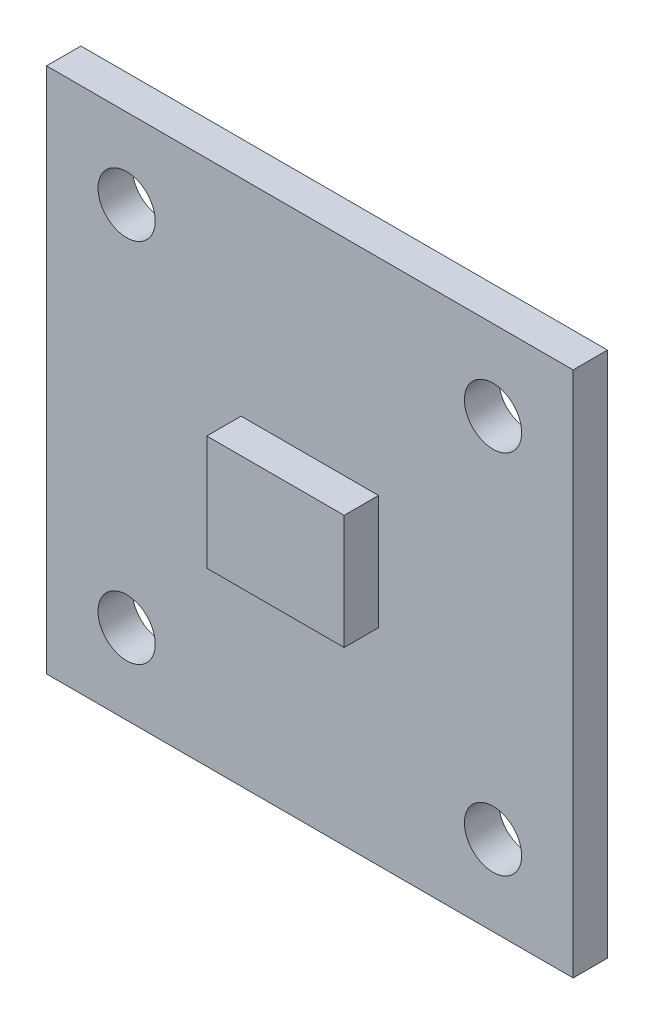
ISO-10303-21;
HEADER;
FILE_DESCRIPTION(('STEP AP214'),'2;1');
FILE_NAME('part.step','',(''),(''),'','','');
FILE_SCHEMA(('AUTOMOTIVE_DESIGN { 1 0 10303 214 1 1 1 1 }'));
ENDSEC;
DATA;
#1=APPLICATION_CONTEXT('core data for automotive mechanical design processes');
#2=APPLICATION_PROTOCOL_DEFINITION('international standard','automotive_design',2000,#1);
#3=PRODUCT_CONTEXT('',#1,'mechanical');
#4=PRODUCT('Part','Part','',(#3));
#5=PRODUCT_RELATED_PRODUCT_CATEGORY('part','',(#4));
#6=PRODUCT_DEFINITION_FORMATION('','',#4);
#7=PRODUCT_DEFINITION_CONTEXT('part definition',#1,'design');
#8=PRODUCT_DEFINITION('design','',#6,#7);
#9=PRODUCT_DEFINITION_SHAPE('','',#8);
#10=(LENGTH_UNIT() NAMED_UNIT(*) SI_UNIT(.MILLI.,.METRE.));
#11=(NAMED_UNIT(*) PLANE_ANGLE_UNIT() SI_UNIT($,.RADIAN.));
#12=(NAMED_UNIT(*) SI_UNIT($,.STERADIAN.) SOLID_ANGLE_UNIT());
#13=UNCERTAINTY_MEASURE_WITH_UNIT(LENGTH_MEASURE(1.E-05),#10,'distance_accuracy_value','');
#14=(GEOMETRIC_REPRESENTATION_CONTEXT(3) GLOBAL_UNCERTAINTY_ASSIGNED_CONTEXT((#13)) GLOBAL_UNIT_ASSIGNED_CONTEXT((#10,
#11,#12)) REPRESENTATION_CONTEXT('',''));
#15=CARTESIAN_POINT('',(0.,0.,0.));
#16=DIRECTION('',(0.,0.,1.));
#17=DIRECTION('',(1.,0.,0.));
#18=AXIS2_PLACEMENT_3D('',#15,#16,#17);
#19=CARTESIAN_POINT('',(0.,0.,0.75));
#20=DIRECTION('',(0.,0.,-1.));
#21=DIRECTION('',(-1.,0.,0.));
#22=AXIS2_PLACEMENT_3D('',#19,#20,#21);
#23=PLANE('',#22);
#24=CARTESIAN_POINT('',(-8.,-8.,0.75));
#25=DIRECTION('',(0.,0.,1.));
#26=DIRECTION('',(1.,0.,0.));
#27=AXIS2_PLACEMENT_3D('',#24,#25,#26);
#28=CIRCLE('',#27,1.25);
#29=CARTESIAN_POINT('',(-6.75,-8.,0.75));
#30=VERTEX_POINT('',#29);
#31=EDGE_CURVE('E123',#30,#30,#28,.T.);
#32=ORIENTED_EDGE('',*,*,#31,.F.);
#33=EDGE_LOOP('',(#32));
#34=FACE_BOUND('',#33,.T.);
#35=CARTESIAN_POINT('',(8.,-8.,0.75));
#36=DIRECTION('',(0.,0.,1.));
#37=DIRECTION('',(1.,0.,0.));
#38=AXIS2_PLACEMENT_3D('',#35,#36,#37);
#39=CIRCLE('',#38,1.25);
#40=CARTESIAN_POINT('',(9.25,-8.,0.75));
#41=VERTEX_POINT('',#40);
#42=EDGE_CURVE('E132',#41,#41,#39,.T.);
#43=ORIENTED_EDGE('',*,*,#42,.F.);
#44=EDGE_LOOP('',(#43));
#45=FACE_BOUND('',#44,.T.);
#46=CARTESIAN_POINT('',(8.,8.,0.75));
#47=DIRECTION('',(0.,0.,1.));
#48=DIRECTION('',(1.,0.,0.));
#49=AXIS2_PLACEMENT_3D('',#46,#47,#48);
#50=CIRCLE('',#49,1.25);
#51=CARTESIAN_POINT('',(9.25,8.,0.75));
#52=VERTEX_POINT('',#51);
#53=EDGE_CURVE('E138',#52,#52,#50,.T.);
#54=ORIENTED_EDGE('',*,*,#53,.F.);
#55=EDGE_LOOP('',(#54));
#56=FACE_BOUND('',#55,.T.);
#57=CARTESIAN_POINT('',(-8.,8.,0.75));
#58=DIRECTION('',(0.,0.,1.));
#59=DIRECTION('',(1.,0.,0.));
#60=AXIS2_PLACEMENT_3D('',#57,#58,#59);
#61=CIRCLE('',#60,1.25);
#62=CARTESIAN_POINT('',(-6.75,8.,0.75));
#63=VERTEX_POINT('',#62);
#64=EDGE_CURVE('E144',#63,#63,#61,.T.);
#65=ORIENTED_EDGE('',*,*,#64,.F.);
#66=EDGE_LOOP('',(#65));
#67=FACE_BOUND('',#66,.T.);
#68=DIRECTION('',(0.,1.,0.));
#69=VECTOR('',#68,1.);
#70=CARTESIAN_POINT('',(11.5,-11.5,0.75));
#71=LINE('',#70,#69);
#72=CARTESIAN_POINT('',(11.5,-11.5,0.75));
#73=VERTEX_POINT('',#72);
#74=CARTESIAN_POINT('',(11.5,11.5,0.75));
#75=VERTEX_POINT('',#74);
#76=EDGE_CURVE('E150',#73,#75,#71,.T.);
#77=ORIENTED_EDGE('',*,*,#76,.T.);
#78=DIRECTION('',(-1.,0.,0.));
#79=VECTOR('',#78,1.);
#80=CARTESIAN_POINT('',(-11.5,11.5,0.75));
#81=LINE('',#80,#79);
#82=CARTESIAN_POINT('',(-11.5,11.5,0.75));
#83=VERTEX_POINT('',#82);
#84=EDGE_CURVE('E153',#75,#83,#81,.T.);
#85=ORIENTED_EDGE('',*,*,#84,.T.);
#86=DIRECTION('',(0.,-1.,0.));
#87=VECTOR('',#86,1.);
#88=CARTESIAN_POINT('',(-11.5,-11.5,0.75));
#89=LINE('',#88,#87);
#90=CARTESIAN_POINT('',(-11.5,-11.5,0.75));
#91=VERTEX_POINT('',#90);
#92=EDGE_CURVE('E156',#83,#91,#89,.T.);
#93=ORIENTED_EDGE('',*,*,#92,.T.);
#94=DIRECTION('',(1.,0.,0.));
#95=VECTOR('',#94,1.);
#96=CARTESIAN_POINT('',(-11.5,-11.5,0.75));
#97=LINE('',#96,#95);
#98=EDGE_CURVE('E158',#91,#73,#97,.T.);
#99=ORIENTED_EDGE('',*,*,#98,.T.);
#100=EDGE_LOOP('',(#77,#85,#93,#99));
#101=FACE_BOUND('',#100,.T.);
#102=DIRECTION('',(0.,1.,0.));
#103=VECTOR('',#102,1.);
#104=CARTESIAN_POINT('',(3.,-2.5,0.75));
#105=LINE('',#104,#103);
#106=CARTESIAN_POINT('',(3.,-2.5,0.75));
#107=VERTEX_POINT('',#106);
#108=CARTESIAN_POINT('',(3.,2.5,0.75));
#109=VERTEX_POINT('',#108);
#110=EDGE_CURVE('E119',#107,#109,#105,.T.);
#111=ORIENTED_EDGE('',*,*,#110,.F.);
#112=DIRECTION('',(1.,0.,0.));
#113=VECTOR('',#112,1.);
#114=CARTESIAN_POINT('',(-3.,-2.5,0.75));
#115=LINE('',#114,#113);
#116=CARTESIAN_POINT('',(-3.,-2.5,0.75));
#117=VERTEX_POINT('',#116);
#118=EDGE_CURVE('E116',#117,#107,#115,.T.);
#119=ORIENTED_EDGE('',*,*,#118,.F.);
#120=DIRECTION('',(0.,-1.,0.));
#121=VECTOR('',#120,1.);
#122=CARTESIAN_POINT('',(-3.,-2.5,0.75));
#123=LINE('',#122,#121);
#124=CARTESIAN_POINT('',(-3.,2.5,0.75));
#125=VERTEX_POINT('',#124);
#126=EDGE_CURVE('E54',#125,#117,#123,.T.);
#127=ORIENTED_EDGE('',*,*,#126,.F.);
#128=DIRECTION('',(-1.,0.,0.));
#129=VECTOR('',#128,1.);
#130=CARTESIAN_POINT('',(-3.,2.5,0.75));
#131=LINE('',#130,#129);
#132=EDGE_CURVE('E49',#109,#125,#131,.T.);
#133=ORIENTED_EDGE('',*,*,#132,.F.);
#134=EDGE_LOOP('',(#111,#119,#127,#133));
#135=FACE_BOUND('',#134,.T.);
#136=ADVANCED_FACE('F34',(#34,#45,#56,#67,#101,#135),#23,.F.);
#137=CARTESIAN_POINT('',(0.,0.,-0.75));
#138=DIRECTION('',(0.,0.,-1.));
#139=DIRECTION('',(-1.,0.,0.));
#140=AXIS2_PLACEMENT_3D('',#137,#138,#139);
#141=PLANE('',#140);
#142=CARTESIAN_POINT('',(8.,-8.,-0.75));
#143=DIRECTION('',(0.,0.,1.));
#144=DIRECTION('',(1.,0.,0.));
#145=AXIS2_PLACEMENT_3D('',#142,#143,#144);
#146=CIRCLE('',#145,1.25);
#147=CARTESIAN_POINT('',(9.25,-8.,-0.75));
#148=VERTEX_POINT('',#147);
#149=EDGE_CURVE('E130',#148,#148,#146,.T.);
#150=ORIENTED_EDGE('',*,*,#149,.T.);
#151=EDGE_LOOP('',(#150));
#152=FACE_BOUND('',#151,.T.);
#153=CARTESIAN_POINT('',(-8.,8.,-0.75));
#154=DIRECTION('',(0.,0.,1.));
#155=DIRECTION('',(1.,0.,0.));
#156=AXIS2_PLACEMENT_3D('',#153,#154,#155);
#157=CIRCLE('',#156,1.25);
#158=CARTESIAN_POINT('',(-6.75,8.,-0.75));
#159=VERTEX_POINT('',#158);
#160=EDGE_CURVE('E141',#159,#159,#157,.T.);
#161=ORIENTED_EDGE('',*,*,#160,.T.);
#162=EDGE_LOOP('',(#161));
#163=FACE_BOUND('',#162,.T.);
#164=DIRECTION('',(0.,1.,0.));
#165=VECTOR('',#164,1.);
#166=CARTESIAN_POINT('',(11.5,-11.5,-0.75));
#167=LINE('',#166,#165);
#168=CARTESIAN_POINT('',(11.5,-11.5,-0.75));
#169=VERTEX_POINT('',#168);
#170=CARTESIAN_POINT('',(11.5,11.5,-0.75));
#171=VERTEX_POINT('',#170);
#172=EDGE_CURVE('E147',#169,#171,#167,.T.);
#173=ORIENTED_EDGE('',*,*,#172,.F.);
#174=DIRECTION('',(1.,0.,0.));
#175=VECTOR('',#174,1.);
#176=CARTESIAN_POINT('',(-11.5,-11.5,-0.75));
#177=LINE('',#176,#175);
#178=CARTESIAN_POINT('',(-11.5,-11.5,-0.75));
#179=VERTEX_POINT('',#178);
#180=EDGE_CURVE('E154',#179,#169,#177,.T.);
#181=ORIENTED_EDGE('',*,*,#180,.F.);
#182=DIRECTION('',(0.,-1.,0.));
#183=VECTOR('',#182,1.);
#184=CARTESIAN_POINT('',(-11.5,-11.5,-0.75));
#185=LINE('',#184,#183);
#186=CARTESIAN_POINT('',(-11.5,11.5,-0.75));
#187=VERTEX_POINT('',#186);
#188=EDGE_CURVE('E165',#187,#179,#185,.T.);
#189=ORIENTED_EDGE('',*,*,#188,.F.);
#190=DIRECTION('',(-1.,0.,0.));
#191=VECTOR('',#190,1.);
#192=CARTESIAN_POINT('',(-11.5,11.5,-0.75));
#193=LINE('',#192,#191);
#194=EDGE_CURVE('E163',#171,#187,#193,.T.);
#195=ORIENTED_EDGE('',*,*,#194,.F.);
#196=EDGE_LOOP('',(#173,#181,#189,#195));
#197=FACE_BOUND('',#196,.T.);
#198=CARTESIAN_POINT('',(8.,8.,-0.75));
#199=DIRECTION('',(0.,0.,1.));
#200=DIRECTION('',(1.,0.,0.));
#201=AXIS2_PLACEMENT_3D('',#198,#199,#200);
#202=CIRCLE('',#201,1.25);
#203=CARTESIAN_POINT('',(9.25,8.,-0.75));
#204=VERTEX_POINT('',#203);
#205=EDGE_CURVE('E135',#204,#204,#202,.T.);
#206=ORIENTED_EDGE('',*,*,#205,.T.);
#207=EDGE_LOOP('',(#206));
#208=FACE_BOUND('',#207,.T.);
#209=CARTESIAN_POINT('',(-8.,-8.,-0.75));
#210=DIRECTION('',(0.,0.,1.));
#211=DIRECTION('',(1.,0.,0.));
#212=AXIS2_PLACEMENT_3D('',#209,#210,#211);
#213=CIRCLE('',#212,1.25);
#214=CARTESIAN_POINT('',(-6.75,-8.,-0.75));
#215=VERTEX_POINT('',#214);
#216=EDGE_CURVE('E120',#215,#215,#213,.T.);
#217=ORIENTED_EDGE('',*,*,#216,.T.);
#218=EDGE_LOOP('',(#217));
#219=FACE_BOUND('',#218,.T.);
#220=ADVANCED_FACE('F183',(#152,#163,#197,#208,#219),#141,.T.);
#221=CARTESIAN_POINT('',(11.5,-11.5,0.75));
#222=DIRECTION('',(-1.,0.,0.));
#223=DIRECTION('',(0.,0.,1.));
#224=AXIS2_PLACEMENT_3D('',#221,#222,#223);
#225=PLANE('',#224);
#226=ORIENTED_EDGE('',*,*,#172,.T.);
#227=DIRECTION('',(0.,0.,-1.));
#228=VECTOR('',#227,1.);
#229=CARTESIAN_POINT('',(11.5,11.5,0.75));
#230=LINE('',#229,#228);
#231=EDGE_CURVE('E11',#75,#171,#230,.T.);
#232=ORIENTED_EDGE('',*,*,#231,.F.);
#233=ORIENTED_EDGE('',*,*,#76,.F.);
#234=DIRECTION('',(0.,0.,-1.));
#235=VECTOR('',#234,1.);
#236=CARTESIAN_POINT('',(11.5,-11.5,0.75));
#237=LINE('',#236,#235);
#238=EDGE_CURVE('E160',#73,#169,#237,.T.);
#239=ORIENTED_EDGE('',*,*,#238,.T.);
#240=EDGE_LOOP('',(#226,#232,#233,#239));
#241=FACE_BOUND('',#240,.T.);
#242=ADVANCED_FACE('F36',(#241),#225,.F.);
#243=CARTESIAN_POINT('',(-11.5,11.5,0.75));
#244=DIRECTION('',(0.,-1.,0.));
#245=DIRECTION('',(0.,0.,-1.));
#246=AXIS2_PLACEMENT_3D('',#243,#244,#245);
#247=PLANE('',#246);
#248=ORIENTED_EDGE('',*,*,#194,.T.);
#249=DIRECTION('',(0.,0.,-1.));
#250=VECTOR('',#249,1.);
#251=CARTESIAN_POINT('',(-11.5,11.5,0.75));
#252=LINE('',#251,#250);
#253=EDGE_CURVE('E42',#83,#187,#252,.T.);
#254=ORIENTED_EDGE('',*,*,#253,.F.);
#255=ORIENTED_EDGE('',*,*,#84,.F.);
#256=ORIENTED_EDGE('',*,*,#231,.T.);
#257=EDGE_LOOP('',(#248,#254,#255,#256));
#258=FACE_BOUND('',#257,.T.);
#259=ADVANCED_FACE('F193',(#258),#247,.F.);
#260=CARTESIAN_POINT('',(-11.5,-11.5,0.75));
#261=DIRECTION('',(1.,0.,0.));
#262=DIRECTION('',(0.,0.,-1.));
#263=AXIS2_PLACEMENT_3D('',#260,#261,#262);
#264=PLANE('',#263);
#265=ORIENTED_EDGE('',*,*,#188,.T.);
#266=DIRECTION('',(0.,0.,-1.));
#267=VECTOR('',#266,1.);
#268=CARTESIAN_POINT('',(-11.5,-11.5,0.75));
#269=LINE('',#268,#267);
#270=EDGE_CURVE('E170',#91,#179,#269,.T.);
#271=ORIENTED_EDGE('',*,*,#270,.F.);
#272=ORIENTED_EDGE('',*,*,#92,.F.);
#273=ORIENTED_EDGE('',*,*,#253,.T.);
#274=EDGE_LOOP('',(#265,#271,#272,#273));
#275=FACE_BOUND('',#274,.T.);
#276=ADVANCED_FACE('F177',(#275),#264,.F.);
#277=CARTESIAN_POINT('',(-11.5,-11.5,0.75));
#278=DIRECTION('',(0.,1.,0.));
#279=DIRECTION('',(0.,0.,1.));
#280=AXIS2_PLACEMENT_3D('',#277,#278,#279);
#281=PLANE('',#280);
#282=ORIENTED_EDGE('',*,*,#180,.T.);
#283=ORIENTED_EDGE('',*,*,#238,.F.);
#284=ORIENTED_EDGE('',*,*,#98,.F.);
#285=ORIENTED_EDGE('',*,*,#270,.T.);
#286=EDGE_LOOP('',(#282,#283,#284,#285));
#287=FACE_BOUND('',#286,.T.);
#288=ADVANCED_FACE('F187',(#287),#281,.F.);
#289=CARTESIAN_POINT('',(-8.,8.,0.75));
#290=DIRECTION('',(0.,0.,-1.));
#291=DIRECTION('',(-1.,0.,0.));
#292=AXIS2_PLACEMENT_3D('',#289,#290,#291);
#293=CYLINDRICAL_SURFACE('',#292,1.25);
#294=ORIENTED_EDGE('',*,*,#64,.T.);
#295=EDGE_LOOP('',(#294));
#296=FACE_BOUND('',#295,.T.);
#297=ORIENTED_EDGE('',*,*,#160,.F.);
#298=EDGE_LOOP('',(#297));
#299=FACE_BOUND('',#298,.T.);
#300=ADVANCED_FACE('F211',(#296,#299),#293,.F.);
#301=CARTESIAN_POINT('',(8.,8.,0.75));
#302=DIRECTION('',(0.,0.,-1.));
#303=DIRECTION('',(-1.,0.,0.));
#304=AXIS2_PLACEMENT_3D('',#301,#302,#303);
#305=CYLINDRICAL_SURFACE('',#304,1.25);
#306=ORIENTED_EDGE('',*,*,#53,.T.);
#307=EDGE_LOOP('',(#306));
#308=FACE_BOUND('',#307,.T.);
#309=ORIENTED_EDGE('',*,*,#205,.F.);
#310=EDGE_LOOP('',(#309));
#311=FACE_BOUND('',#310,.T.);
#312=ADVANCED_FACE('F218',(#308,#311),#305,.F.);
#313=CARTESIAN_POINT('',(8.,-8.,0.75));
#314=DIRECTION('',(0.,0.,-1.));
#315=DIRECTION('',(-1.,0.,0.));
#316=AXIS2_PLACEMENT_3D('',#313,#314,#315);
#317=CYLINDRICAL_SURFACE('',#316,1.25);
#318=ORIENTED_EDGE('',*,*,#42,.T.);
#319=EDGE_LOOP('',(#318));
#320=FACE_BOUND('',#319,.T.);
#321=ORIENTED_EDGE('',*,*,#149,.F.);
#322=EDGE_LOOP('',(#321));
#323=FACE_BOUND('',#322,.T.);
#324=ADVANCED_FACE('F223',(#320,#323),#317,.F.);
#325=CARTESIAN_POINT('',(-8.,-8.,0.75));
#326=DIRECTION('',(0.,0.,-1.));
#327=DIRECTION('',(-1.,0.,0.));
#328=AXIS2_PLACEMENT_3D('',#325,#326,#327);
#329=CYLINDRICAL_SURFACE('',#328,1.25);
#330=ORIENTED_EDGE('',*,*,#31,.T.);
#331=EDGE_LOOP('',(#330));
#332=FACE_BOUND('',#331,.T.);
#333=ORIENTED_EDGE('',*,*,#216,.F.);
#334=EDGE_LOOP('',(#333));
#335=FACE_BOUND('',#334,.T.);
#336=ADVANCED_FACE('F233',(#332,#335),#329,.F.);
#337=CARTESIAN_POINT('',(3.,-2.5,2.25));
#338=DIRECTION('',(-1.,0.,0.));
#339=DIRECTION('',(0.,0.,1.));
#340=AXIS2_PLACEMENT_3D('',#337,#338,#339);
#341=PLANE('',#340);
#342=ORIENTED_EDGE('',*,*,#110,.T.);
#343=DIRECTION('',(0.,0.,-1.));
#344=VECTOR('',#343,1.);
#345=CARTESIAN_POINT('',(3.,2.5,2.25));
#346=LINE('',#345,#344);
#347=CARTESIAN_POINT('',(3.,2.5,2.25));
#348=VERTEX_POINT('',#347);
#349=EDGE_CURVE('E100',#348,#109,#346,.T.);
#350=ORIENTED_EDGE('',*,*,#349,.F.);
#351=DIRECTION('',(0.,1.,0.));
#352=VECTOR('',#351,1.);
#353=CARTESIAN_POINT('',(3.,-2.5,2.25));
#354=LINE('',#353,#352);
#355=CARTESIAN_POINT('',(3.,-2.5,2.25));
#356=VERTEX_POINT('',#355);
#357=EDGE_CURVE('E107',#356,#348,#354,.T.);
#358=ORIENTED_EDGE('',*,*,#357,.F.);
#359=DIRECTION('',(0.,0.,-1.));
#360=VECTOR('',#359,1.);
#361=CARTESIAN_POINT('',(3.,-2.5,2.25));
#362=LINE('',#361,#360);
#363=EDGE_CURVE('E336',#356,#107,#362,.T.);
#364=ORIENTED_EDGE('',*,*,#363,.T.);
#365=EDGE_LOOP('',(#342,#350,#358,#364));
#366=FACE_BOUND('',#365,.T.);
#367=ADVANCED_FACE('F118',(#366),#341,.F.);
#368=CARTESIAN_POINT('',(-3.,2.5,2.25));
#369=DIRECTION('',(0.,-1.,0.));
#370=DIRECTION('',(0.,0.,-1.));
#371=AXIS2_PLACEMENT_3D('',#368,#369,#370);
#372=PLANE('',#371);
#373=ORIENTED_EDGE('',*,*,#132,.T.);
#374=DIRECTION('',(0.,0.,-1.));
#375=VECTOR('',#374,1.);
#376=CARTESIAN_POINT('',(-3.,2.5,2.25));
#377=LINE('',#376,#375);
#378=CARTESIAN_POINT('',(-3.,2.5,2.25));
#379=VERTEX_POINT('',#378);
#380=EDGE_CURVE('E103',#379,#125,#377,.T.);
#381=ORIENTED_EDGE('',*,*,#380,.F.);
#382=DIRECTION('',(-1.,0.,0.));
#383=VECTOR('',#382,1.);
#384=CARTESIAN_POINT('',(-3.,2.5,2.25));
#385=LINE('',#384,#383);
#386=EDGE_CURVE('E96',#348,#379,#385,.T.);
#387=ORIENTED_EDGE('',*,*,#386,.F.);
#388=ORIENTED_EDGE('',*,*,#349,.T.);
#389=EDGE_LOOP('',(#373,#381,#387,#388));
#390=FACE_BOUND('',#389,.T.);
#391=ADVANCED_FACE('F98',(#390),#372,.F.);
#392=CARTESIAN_POINT('',(-3.,-2.5,2.25));
#393=DIRECTION('',(1.,0.,0.));
#394=DIRECTION('',(0.,0.,-1.));
#395=AXIS2_PLACEMENT_3D('',#392,#393,#394);
#396=PLANE('',#395);
#397=ORIENTED_EDGE('',*,*,#126,.T.);
#398=DIRECTION('',(0.,0.,-1.));
#399=VECTOR('',#398,1.);
#400=CARTESIAN_POINT('',(-3.,-2.5,2.25));
#401=LINE('',#400,#399);
#402=CARTESIAN_POINT('',(-3.,-2.5,2.25));
#403=VERTEX_POINT('',#402);
#404=EDGE_CURVE('E125',#403,#117,#401,.T.);
#405=ORIENTED_EDGE('',*,*,#404,.F.);
#406=DIRECTION('',(0.,-1.,0.));
#407=VECTOR('',#406,1.);
#408=CARTESIAN_POINT('',(-3.,-2.5,2.25));
#409=LINE('',#408,#407);
#410=EDGE_CURVE('E106',#379,#403,#409,.T.);
#411=ORIENTED_EDGE('',*,*,#410,.F.);
#412=ORIENTED_EDGE('',*,*,#380,.T.);
#413=EDGE_LOOP('',(#397,#405,#411,#412));
#414=FACE_BOUND('',#413,.T.);
#415=ADVANCED_FACE('F245',(#414),#396,.F.);
#416=CARTESIAN_POINT('',(-3.,-2.5,2.25));
#417=DIRECTION('',(0.,1.,0.));
#418=DIRECTION('',(0.,0.,1.));
#419=AXIS2_PLACEMENT_3D('',#416,#417,#418);
#420=PLANE('',#419);
#421=ORIENTED_EDGE('',*,*,#118,.T.);
#422=ORIENTED_EDGE('',*,*,#363,.F.);
#423=DIRECTION('',(1.,0.,0.));
#424=VECTOR('',#423,1.);
#425=CARTESIAN_POINT('',(-3.,-2.5,2.25));
#426=LINE('',#425,#424);
#427=EDGE_CURVE('E112',#403,#356,#426,.T.);
#428=ORIENTED_EDGE('',*,*,#427,.F.);
#429=ORIENTED_EDGE('',*,*,#404,.T.);
#430=EDGE_LOOP('',(#421,#422,#428,#429));
#431=FACE_BOUND('',#430,.T.);
#432=ADVANCED_FACE('F248',(#431),#420,.F.);
#433=CARTESIAN_POINT('',(0.,0.,2.25));
#434=DIRECTION('',(0.,0.,-1.));
#435=DIRECTION('',(-1.,0.,0.));
#436=AXIS2_PLACEMENT_3D('',#433,#434,#435);
#437=PLANE('',#436);
#438=ORIENTED_EDGE('',*,*,#357,.T.);
#439=ORIENTED_EDGE('',*,*,#386,.T.);
#440=ORIENTED_EDGE('',*,*,#410,.T.);
#441=ORIENTED_EDGE('',*,*,#427,.T.);
#442=EDGE_LOOP('',(#438,#439,#440,#441));
#443=FACE_BOUND('',#442,.T.);
#444=ADVANCED_FACE('F110',(#443),#437,.F.);
#445=CLOSED_SHELL('',(#136,#220,#242,#259,#276,#288,#300,#312,#324,#336,#367,#391,#415,#432,#444));
#446=MANIFOLD_SOLID_BREP('B2',#445);
#447=ADVANCED_BREP_SHAPE_REPRESENTATION('',(#18,#446),#14);
#448=SHAPE_DEFINITION_REPRESENTATION(#9,#447);
ENDSEC;
END-ISO-10303-21;
